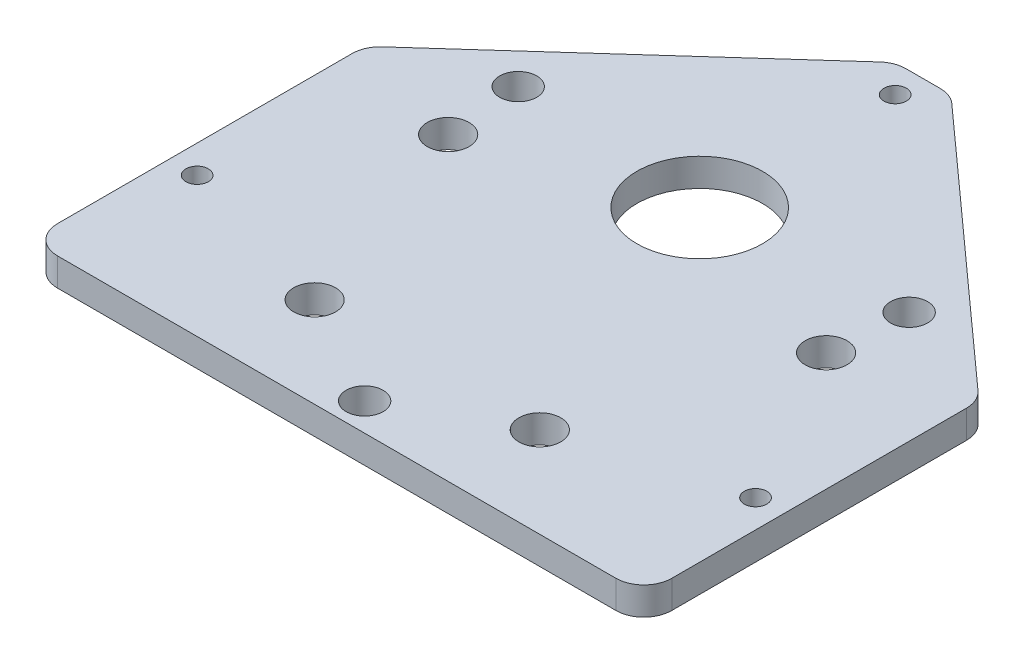
ISO-10303-21;
HEADER;
FILE_DESCRIPTION(('STEP AP214'),'2;1');
FILE_NAME('part.step','',(''),(''),'','','');
FILE_SCHEMA(('AUTOMOTIVE_DESIGN { 1 0 10303 214 1 1 1 1 }'));
ENDSEC;
DATA;
#1=APPLICATION_CONTEXT('core data for automotive mechanical design processes');
#2=APPLICATION_PROTOCOL_DEFINITION('international standard','automotive_design',2000,#1);
#3=PRODUCT_CONTEXT('',#1,'mechanical');
#4=PRODUCT('Part','Part','',(#3));
#5=PRODUCT_RELATED_PRODUCT_CATEGORY('part','',(#4));
#6=PRODUCT_DEFINITION_FORMATION('','',#4);
#7=PRODUCT_DEFINITION_CONTEXT('part definition',#1,'design');
#8=PRODUCT_DEFINITION('design','',#6,#7);
#9=PRODUCT_DEFINITION_SHAPE('','',#8);
#10=(LENGTH_UNIT() NAMED_UNIT(*) SI_UNIT(.MILLI.,.METRE.));
#11=(NAMED_UNIT(*) PLANE_ANGLE_UNIT() SI_UNIT($,.RADIAN.));
#12=(NAMED_UNIT(*) SI_UNIT($,.STERADIAN.) SOLID_ANGLE_UNIT());
#13=UNCERTAINTY_MEASURE_WITH_UNIT(LENGTH_MEASURE(1.E-05),#10,'distance_accuracy_value','');
#14=(GEOMETRIC_REPRESENTATION_CONTEXT(3) GLOBAL_UNCERTAINTY_ASSIGNED_CONTEXT((#13)) GLOBAL_UNIT_ASSIGNED_CONTEXT((#10,
#11,#12)) REPRESENTATION_CONTEXT('',''));
#15=CARTESIAN_POINT('',(0.,0.,0.));
#16=DIRECTION('',(0.,0.,1.));
#17=DIRECTION('',(1.,0.,0.));
#18=AXIS2_PLACEMENT_3D('',#15,#16,#17);
#19=CARTESIAN_POINT('',(-69.85,6.35,-57.15));
#20=DIRECTION('',(1.,0.,0.));
#21=DIRECTION('',(0.,0.,-1.));
#22=AXIS2_PLACEMENT_3D('',#19,#20,#21);
#23=PLANE('',#22);
#24=DIRECTION('',(0.,0.,1.));
#25=VECTOR('',#24,1.);
#26=CARTESIAN_POINT('',(-69.85,6.35,-57.15));
#27=LINE('',#26,#25);
#28=CARTESIAN_POINT('',(-69.85,6.35,-54.3219487301082));
#29=VERTEX_POINT('',#28);
#30=CARTESIAN_POINT('',(-69.85,6.35,12.7));
#31=VERTEX_POINT('',#30);
#32=EDGE_CURVE('E151',#29,#31,#27,.T.);
#33=ORIENTED_EDGE('',*,*,#32,.F.);
#34=DIRECTION('',(0.,-1.,0.));
#35=VECTOR('',#34,1.);
#36=CARTESIAN_POINT('',(-69.85,6.35,-54.3219487301082));
#37=LINE('',#36,#35);
#38=CARTESIAN_POINT('',(-69.85,0.,-54.3219487301082));
#39=VERTEX_POINT('',#38);
#40=EDGE_CURVE('E11',#29,#39,#37,.T.);
#41=ORIENTED_EDGE('',*,*,#40,.T.);
#42=DIRECTION('',(0.,0.,1.));
#43=VECTOR('',#42,1.);
#44=CARTESIAN_POINT('',(-69.85,0.,-57.15));
#45=LINE('',#44,#43);
#46=CARTESIAN_POINT('',(-69.85,0.,12.7));
#47=VERTEX_POINT('',#46);
#48=EDGE_CURVE('E221',#39,#47,#45,.T.);
#49=ORIENTED_EDGE('',*,*,#48,.T.);
#50=DIRECTION('',(0.,-1.,0.));
#51=VECTOR('',#50,1.);
#52=CARTESIAN_POINT('',(-69.85,6.35,12.7));
#53=LINE('',#52,#51);
#54=EDGE_CURVE('E41',#47,#31,#53,.F.);
#55=ORIENTED_EDGE('',*,*,#54,.T.);
#56=EDGE_LOOP('',(#33,#41,#49,#55));
#57=FACE_BOUND('',#56,.T.);
#58=ADVANCED_FACE('F33',(#57),#23,.F.);
#59=CARTESIAN_POINT('',(-69.85,6.35,19.05));
#60=DIRECTION('',(0.,0.,-1.));
#61=DIRECTION('',(-1.,0.,0.));
#62=AXIS2_PLACEMENT_3D('',#59,#60,#61);
#63=PLANE('',#62);
#64=DIRECTION('',(1.,0.,0.));
#65=VECTOR('',#64,1.);
#66=CARTESIAN_POINT('',(-69.85,0.,19.05));
#67=LINE('',#66,#65);
#68=CARTESIAN_POINT('',(-63.5,0.,19.05));
#69=VERTEX_POINT('',#68);
#70=CARTESIAN_POINT('',(63.5,0.,19.05));
#71=VERTEX_POINT('',#70);
#72=EDGE_CURVE('E234',#69,#71,#67,.T.);
#73=ORIENTED_EDGE('',*,*,#72,.T.);
#74=DIRECTION('',(0.,-1.,0.));
#75=VECTOR('',#74,1.);
#76=CARTESIAN_POINT('',(63.5,6.35,19.05));
#77=LINE('',#76,#75);
#78=CARTESIAN_POINT('',(63.5,6.35,19.05));
#79=VERTEX_POINT('',#78);
#80=EDGE_CURVE('E215',#71,#79,#77,.F.);
#81=ORIENTED_EDGE('',*,*,#80,.T.);
#82=DIRECTION('',(1.,0.,0.));
#83=VECTOR('',#82,1.);
#84=CARTESIAN_POINT('',(-69.85,6.35,19.05));
#85=LINE('',#84,#83);
#86=CARTESIAN_POINT('',(-63.5,6.35,19.05));
#87=VERTEX_POINT('',#86);
#88=EDGE_CURVE('E155',#87,#79,#85,.T.);
#89=ORIENTED_EDGE('',*,*,#88,.F.);
#90=DIRECTION('',(0.,-1.,0.));
#91=VECTOR('',#90,1.);
#92=CARTESIAN_POINT('',(-63.5,6.35,19.05));
#93=LINE('',#92,#91);
#94=EDGE_CURVE('E212',#87,#69,#93,.T.);
#95=ORIENTED_EDGE('',*,*,#94,.T.);
#96=EDGE_LOOP('',(#73,#81,#89,#95));
#97=FACE_BOUND('',#96,.T.);
#98=ADVANCED_FACE('F233',(#97),#63,.F.);
#99=CARTESIAN_POINT('',(69.85,6.35,19.05));
#100=DIRECTION('',(-1.,0.,0.));
#101=DIRECTION('',(0.,0.,1.));
#102=AXIS2_PLACEMENT_3D('',#99,#100,#101);
#103=PLANE('',#102);
#104=DIRECTION('',(0.,0.,-1.));
#105=VECTOR('',#104,1.);
#106=CARTESIAN_POINT('',(69.85,0.,19.05));
#107=LINE('',#106,#105);
#108=CARTESIAN_POINT('',(69.85,0.,12.7));
#109=VERTEX_POINT('',#108);
#110=CARTESIAN_POINT('',(69.85,0.,-54.3219487301082));
#111=VERTEX_POINT('',#110);
#112=EDGE_CURVE('E237',#109,#111,#107,.T.);
#113=ORIENTED_EDGE('',*,*,#112,.T.);
#114=DIRECTION('',(0.,-1.,0.));
#115=VECTOR('',#114,1.);
#116=CARTESIAN_POINT('',(69.85,6.35,-54.3219487301082));
#117=LINE('',#116,#115);
#118=CARTESIAN_POINT('',(69.85,6.35,-54.3219487301082));
#119=VERTEX_POINT('',#118);
#120=EDGE_CURVE('E210',#111,#119,#117,.F.);
#121=ORIENTED_EDGE('',*,*,#120,.T.);
#122=DIRECTION('',(0.,0.,-1.));
#123=VECTOR('',#122,1.);
#124=CARTESIAN_POINT('',(69.85,6.35,19.05));
#125=LINE('',#124,#123);
#126=CARTESIAN_POINT('',(69.85,6.35,12.7));
#127=VERTEX_POINT('',#126);
#128=EDGE_CURVE('E257',#127,#119,#125,.T.);
#129=ORIENTED_EDGE('',*,*,#128,.F.);
#130=DIRECTION('',(0.,-1.,0.));
#131=VECTOR('',#130,1.);
#132=CARTESIAN_POINT('',(69.85,6.35,12.7));
#133=LINE('',#132,#131);
#134=EDGE_CURVE('E207',#127,#109,#133,.T.);
#135=ORIENTED_EDGE('',*,*,#134,.T.);
#136=EDGE_LOOP('',(#113,#121,#129,#135));
#137=FACE_BOUND('',#136,.T.);
#138=ADVANCED_FACE('F353',(#137),#103,.F.);
#139=CARTESIAN_POINT('',(69.85,6.35,-57.15));
#140=DIRECTION('',(-0.66896473162245,0.,0.743294146247166));
#141=DIRECTION('',(0.743294146247166,0.,0.66896473162245));
#142=AXIS2_PLACEMENT_3D('',#139,#140,#141);
#143=PLANE('',#142);
#144=DIRECTION('',(-0.743294146247166,0.,-0.66896473162245));
#145=VECTOR('',#144,1.);
#146=CARTESIAN_POINT('',(69.85,0.,-57.15));
#147=LINE('',#146,#145);
#148=CARTESIAN_POINT('',(67.7479260458025,0.,-59.0418665587777));
#149=VERTEX_POINT('',#148);
#150=CARTESIAN_POINT('',(8.16120241258942,0.,-112.669917828669));
#151=VERTEX_POINT('',#150);
#152=EDGE_CURVE('E157',#149,#151,#147,.T.);
#153=ORIENTED_EDGE('',*,*,#152,.T.);
#154=DIRECTION('',(0.,-1.,0.));
#155=VECTOR('',#154,1.);
#156=CARTESIAN_POINT('',(8.16120241258941,6.35,-112.669917828669));
#157=LINE('',#156,#155);
#158=CARTESIAN_POINT('',(8.16120241258942,6.35,-112.669917828669));
#159=VERTEX_POINT('',#158);
#160=EDGE_CURVE('E48',#151,#159,#157,.F.);
#161=ORIENTED_EDGE('',*,*,#160,.T.);
#162=DIRECTION('',(-0.743294146247166,0.,-0.66896473162245));
#163=VECTOR('',#162,1.);
#164=CARTESIAN_POINT('',(69.85,6.35,-57.15));
#165=LINE('',#164,#163);
#166=CARTESIAN_POINT('',(67.7479260458025,6.35,-59.0418665587777));
#167=VERTEX_POINT('',#166);
#168=EDGE_CURVE('E253',#167,#159,#165,.T.);
#169=ORIENTED_EDGE('',*,*,#168,.F.);
#170=DIRECTION('',(0.,-1.,0.));
#171=VECTOR('',#170,1.);
#172=CARTESIAN_POINT('',(67.7479260458025,6.35,-59.0418665587777));
#173=LINE('',#172,#171);
#174=EDGE_CURVE('E203',#167,#149,#173,.T.);
#175=ORIENTED_EDGE('',*,*,#174,.T.);
#176=EDGE_LOOP('',(#153,#161,#169,#175));
#177=FACE_BOUND('',#176,.T.);
#178=ADVANCED_FACE('F245',(#177),#143,.F.);
#179=CARTESIAN_POINT('',(6.34999999999999,6.35,-114.3));
#180=DIRECTION('',(0.,0.,1.));
#181=DIRECTION('',(1.,0.,0.));
#182=AXIS2_PLACEMENT_3D('',#179,#180,#181);
#183=PLANE('',#182);
#184=DIRECTION('',(-1.,0.,0.));
#185=VECTOR('',#184,1.);
#186=CARTESIAN_POINT('',(6.34999999999999,0.,-114.3));
#187=LINE('',#186,#185);
#188=CARTESIAN_POINT('',(3.91327636678685,0.,-114.3));
#189=VERTEX_POINT('',#188);
#190=CARTESIAN_POINT('',(-3.91327636678688,0.,-114.3));
#191=VERTEX_POINT('',#190);
#192=EDGE_CURVE('E152',#189,#191,#187,.T.);
#193=ORIENTED_EDGE('',*,*,#192,.T.);
#194=DIRECTION('',(0.,-1.,0.));
#195=VECTOR('',#194,1.);
#196=CARTESIAN_POINT('',(-3.91327636678688,6.35,-114.3));
#197=LINE('',#196,#195);
#198=CARTESIAN_POINT('',(-3.91327636678688,6.35,-114.3));
#199=VERTEX_POINT('',#198);
#200=EDGE_CURVE('E129',#191,#199,#197,.F.);
#201=ORIENTED_EDGE('',*,*,#200,.T.);
#202=DIRECTION('',(-1.,0.,0.));
#203=VECTOR('',#202,1.);
#204=CARTESIAN_POINT('',(6.34999999999999,6.35,-114.3));
#205=LINE('',#204,#203);
#206=CARTESIAN_POINT('',(3.91327636678685,6.35,-114.3));
#207=VERTEX_POINT('',#206);
#208=EDGE_CURVE('E252',#207,#199,#205,.T.);
#209=ORIENTED_EDGE('',*,*,#208,.F.);
#210=DIRECTION('',(0.,-1.,0.));
#211=VECTOR('',#210,1.);
#212=CARTESIAN_POINT('',(3.91327636678685,6.35,-114.3));
#213=LINE('',#212,#211);
#214=EDGE_CURVE('E134',#207,#189,#213,.T.);
#215=ORIENTED_EDGE('',*,*,#214,.T.);
#216=EDGE_LOOP('',(#193,#201,#209,#215));
#217=FACE_BOUND('',#216,.T.);
#218=ADVANCED_FACE('F255',(#217),#183,.F.);
#219=CARTESIAN_POINT('',(-6.35000000000001,6.35,-114.3));
#220=DIRECTION('',(0.66896473162245,0.,0.743294146247166));
#221=DIRECTION('',(0.743294146247166,0.,-0.66896473162245));
#222=AXIS2_PLACEMENT_3D('',#219,#220,#221);
#223=PLANE('',#222);
#224=DIRECTION('',(-0.743294146247166,0.,0.66896473162245));
#225=VECTOR('',#224,1.);
#226=CARTESIAN_POINT('',(-6.35000000000001,6.35,-114.3));
#227=LINE('',#226,#225);
#228=CARTESIAN_POINT('',(-8.16120241258944,6.35,-112.66991782867));
#229=VERTEX_POINT('',#228);
#230=CARTESIAN_POINT('',(-67.7479260458025,6.35,-59.0418665587777));
#231=VERTEX_POINT('',#230);
#232=EDGE_CURVE('E144',#229,#231,#227,.T.);
#233=ORIENTED_EDGE('',*,*,#232,.F.);
#234=DIRECTION('',(0.,-1.,0.));
#235=VECTOR('',#234,1.);
#236=CARTESIAN_POINT('',(-8.16120241258944,6.35,-112.66991782867));
#237=LINE('',#236,#235);
#238=CARTESIAN_POINT('',(-8.16120241258944,0.,-112.66991782867));
#239=VERTEX_POINT('',#238);
#240=EDGE_CURVE('E128',#229,#239,#237,.T.);
#241=ORIENTED_EDGE('',*,*,#240,.T.);
#242=DIRECTION('',(-0.743294146247166,0.,0.66896473162245));
#243=VECTOR('',#242,1.);
#244=CARTESIAN_POINT('',(-6.35000000000001,0.,-114.3));
#245=LINE('',#244,#243);
#246=CARTESIAN_POINT('',(-67.7479260458025,0.,-59.0418665587777));
#247=VERTEX_POINT('',#246);
#248=EDGE_CURVE('E141',#239,#247,#245,.T.);
#249=ORIENTED_EDGE('',*,*,#248,.T.);
#250=DIRECTION('',(0.,-1.,0.));
#251=VECTOR('',#250,1.);
#252=CARTESIAN_POINT('',(-67.7479260458026,6.35,-59.0418665587777));
#253=LINE('',#252,#251);
#254=EDGE_CURVE('E146',#247,#231,#253,.F.);
#255=ORIENTED_EDGE('',*,*,#254,.T.);
#256=EDGE_LOOP('',(#233,#241,#249,#255));
#257=FACE_BOUND('',#256,.T.);
#258=ADVANCED_FACE('F140',(#257),#223,.F.);
#259=CARTESIAN_POINT('',(0.,6.35,0.));
#260=DIRECTION('',(0.,1.,0.));
#261=DIRECTION('',(0.,0.,1.));
#262=AXIS2_PLACEMENT_3D('',#259,#260,#261);
#263=PLANE('',#262);
#264=CARTESIAN_POINT('',(44.4499999999999,6.35,-66.675));
#265=DIRECTION('',(0.,-1.,0.));
#266=DIRECTION('',(0.,0.,-1.));
#267=AXIS2_PLACEMENT_3D('',#264,#265,#266);
#268=CIRCLE('',#267,4.2164);
#269=CARTESIAN_POINT('',(44.4499999999999,6.35,-70.8914));
#270=VERTEX_POINT('',#269);
#271=EDGE_CURVE('E301',#270,#270,#268,.T.);
#272=ORIENTED_EDGE('',*,*,#271,.T.);
#273=EDGE_LOOP('',(#272));
#274=FACE_BOUND('',#273,.T.);
#275=CARTESIAN_POINT('',(-44.4500000000001,6.35,-66.675));
#276=DIRECTION('',(0.,-1.,0.));
#277=DIRECTION('',(0.,0.,-1.));
#278=AXIS2_PLACEMENT_3D('',#275,#276,#277);
#279=CIRCLE('',#278,4.2164);
#280=CARTESIAN_POINT('',(-44.4500000000001,6.35,-70.8914));
#281=VERTEX_POINT('',#280);
#282=EDGE_CURVE('E295',#281,#281,#279,.T.);
#283=ORIENTED_EDGE('',*,*,#282,.T.);
#284=EDGE_LOOP('',(#283));
#285=FACE_BOUND('',#284,.T.);
#286=CARTESIAN_POINT('',(0.,6.35,12.7));
#287=DIRECTION('',(0.,-1.,0.));
#288=DIRECTION('',(0.,0.,-1.));
#289=AXIS2_PLACEMENT_3D('',#286,#287,#288);
#290=CIRCLE('',#289,4.2164);
#291=CARTESIAN_POINT('',(0.,6.35,8.48359999999998));
#292=VERTEX_POINT('',#291);
#293=EDGE_CURVE('E289',#292,#292,#290,.T.);
#294=ORIENTED_EDGE('',*,*,#293,.T.);
#295=EDGE_LOOP('',(#294));
#296=FACE_BOUND('',#295,.T.);
#297=CARTESIAN_POINT('',(-63.5,6.35,-12.7));
#298=DIRECTION('',(0.,1.,0.));
#299=DIRECTION('',(0.,0.,1.));
#300=AXIS2_PLACEMENT_3D('',#297,#298,#299);
#301=CIRCLE('',#300,2.55269999999999);
#302=CARTESIAN_POINT('',(-63.5,6.35,-10.1473));
#303=VERTEX_POINT('',#302);
#304=EDGE_CURVE('E286',#303,#303,#301,.T.);
#305=ORIENTED_EDGE('',*,*,#304,.F.);
#306=EDGE_LOOP('',(#305));
#307=FACE_BOUND('',#306,.T.);
#308=CARTESIAN_POINT('',(63.5000000000001,6.35,-12.7));
#309=DIRECTION('',(0.,1.,0.));
#310=DIRECTION('',(0.,0.,1.));
#311=AXIS2_PLACEMENT_3D('',#308,#309,#310);
#312=CIRCLE('',#311,2.55269999999999);
#313=CARTESIAN_POINT('',(63.5000000000001,6.35,-10.1473));
#314=VERTEX_POINT('',#313);
#315=EDGE_CURVE('E180',#314,#314,#312,.T.);
#316=ORIENTED_EDGE('',*,*,#315,.F.);
#317=EDGE_LOOP('',(#316));
#318=FACE_BOUND('',#317,.T.);
#319=CARTESIAN_POINT('',(0.,6.35,-107.95));
#320=DIRECTION('',(0.,1.,0.));
#321=DIRECTION('',(0.,0.,1.));
#322=AXIS2_PLACEMENT_3D('',#319,#320,#321);
#323=CIRCLE('',#322,2.55269999999999);
#324=CARTESIAN_POINT('',(0.,6.35,-105.3973));
#325=VERTEX_POINT('',#324);
#326=EDGE_CURVE('E179',#325,#325,#323,.T.);
#327=ORIENTED_EDGE('',*,*,#326,.F.);
#328=EDGE_LOOP('',(#327));
#329=FACE_BOUND('',#328,.T.);
#330=CARTESIAN_POINT('',(-25.6026883595281,6.35,-1.53180743203795));
#331=DIRECTION('',(0.,1.,0.));
#332=DIRECTION('',(0.,0.,1.));
#333=AXIS2_PLACEMENT_3D('',#330,#331,#332);
#334=CIRCLE('',#333,4.76250000000001);
#335=CARTESIAN_POINT('',(-25.6026883595281,6.35,3.23069256796206));
#336=VERTEX_POINT('',#335);
#337=EDGE_CURVE('E170',#336,#336,#334,.T.);
#338=ORIENTED_EDGE('',*,*,#337,.F.);
#339=EDGE_LOOP('',(#338));
#340=FACE_BOUND('',#339,.T.);
#341=CARTESIAN_POINT('',(25.6026883595282,6.35,-1.53180743203789));
#342=DIRECTION('',(0.,1.,0.));
#343=DIRECTION('',(0.,0.,1.));
#344=AXIS2_PLACEMENT_3D('',#341,#342,#343);
#345=CIRCLE('',#344,4.76250000000001);
#346=CARTESIAN_POINT('',(25.6026883595282,6.35,3.23069256796212));
#347=VERTEX_POINT('',#346);
#348=EDGE_CURVE('E271',#347,#347,#345,.T.);
#349=ORIENTED_EDGE('',*,*,#348,.F.);
#350=EDGE_LOOP('',(#349));
#351=FACE_BOUND('',#350,.T.);
#352=CARTESIAN_POINT('',(42.9773116404719,6.35,-49.2681925679621));
#353=DIRECTION('',(0.,1.,0.));
#354=DIRECTION('',(0.,0.,1.));
#355=AXIS2_PLACEMENT_3D('',#352,#353,#354);
#356=CIRCLE('',#355,4.76250000000001);
#357=CARTESIAN_POINT('',(42.9773116404719,6.35,-44.5056925679621));
#358=VERTEX_POINT('',#357);
#359=EDGE_CURVE('E268',#358,#358,#356,.T.);
#360=ORIENTED_EDGE('',*,*,#359,.F.);
#361=EDGE_LOOP('',(#360));
#362=FACE_BOUND('',#361,.T.);
#363=CARTESIAN_POINT('',(-42.9773116404717,6.35,-49.2681925679622));
#364=DIRECTION('',(0.,1.,0.));
#365=DIRECTION('',(0.,0.,1.));
#366=AXIS2_PLACEMENT_3D('',#363,#364,#365);
#367=CIRCLE('',#366,4.76250000000001);
#368=CARTESIAN_POINT('',(-42.9773116404717,6.35,-44.5056925679622));
#369=VERTEX_POINT('',#368);
#370=EDGE_CURVE('E165',#369,#369,#367,.T.);
#371=ORIENTED_EDGE('',*,*,#370,.F.);
#372=EDGE_LOOP('',(#371));
#373=FACE_BOUND('',#372,.T.);
#374=CARTESIAN_POINT('',(0.,6.35,-63.5));
#375=DIRECTION('',(0.,1.,0.));
#376=DIRECTION('',(0.,0.,1.));
#377=AXIS2_PLACEMENT_3D('',#374,#375,#376);
#378=CIRCLE('',#377,14.2875);
#379=CARTESIAN_POINT('',(0.,6.35,-49.2125));
#380=VERTEX_POINT('',#379);
#381=EDGE_CURVE('E164',#380,#380,#378,.T.);
#382=ORIENTED_EDGE('',*,*,#381,.F.);
#383=EDGE_LOOP('',(#382));
#384=FACE_BOUND('',#383,.T.);
#385=ORIENTED_EDGE('',*,*,#208,.T.);
#386=CARTESIAN_POINT('',(-3.91327636678688,6.35,-107.95));
#387=DIRECTION('',(0.,1.,0.));
#388=DIRECTION('',(0.,0.,1.));
#389=AXIS2_PLACEMENT_3D('',#386,#387,#388);
#390=CIRCLE('',#389,6.35);
#391=EDGE_CURVE('E201',#199,#229,#390,.T.);
#392=ORIENTED_EDGE('',*,*,#391,.T.);
#393=ORIENTED_EDGE('',*,*,#232,.T.);
#394=CARTESIAN_POINT('',(-63.5,6.35,-54.3219487301082));
#395=DIRECTION('',(0.,1.,0.));
#396=DIRECTION('',(0.,0.,1.));
#397=AXIS2_PLACEMENT_3D('',#394,#395,#396);
#398=CIRCLE('',#397,6.35);
#399=EDGE_CURVE('E194',#231,#29,#398,.T.);
#400=ORIENTED_EDGE('',*,*,#399,.T.);
#401=ORIENTED_EDGE('',*,*,#32,.T.);
#402=CARTESIAN_POINT('',(-63.5,6.35,12.7));
#403=DIRECTION('',(0.,1.,0.));
#404=DIRECTION('',(0.,0.,1.));
#405=AXIS2_PLACEMENT_3D('',#402,#403,#404);
#406=CIRCLE('',#405,6.35);
#407=EDGE_CURVE('E192',#31,#87,#406,.T.);
#408=ORIENTED_EDGE('',*,*,#407,.T.);
#409=ORIENTED_EDGE('',*,*,#88,.T.);
#410=CARTESIAN_POINT('',(63.5,6.35,12.7));
#411=DIRECTION('',(0.,1.,0.));
#412=DIRECTION('',(0.,0.,1.));
#413=AXIS2_PLACEMENT_3D('',#410,#411,#412);
#414=CIRCLE('',#413,6.35);
#415=EDGE_CURVE('E196',#79,#127,#414,.T.);
#416=ORIENTED_EDGE('',*,*,#415,.T.);
#417=ORIENTED_EDGE('',*,*,#128,.T.);
#418=CARTESIAN_POINT('',(63.5,6.35,-54.3219487301082));
#419=DIRECTION('',(0.,1.,0.));
#420=DIRECTION('',(0.,0.,1.));
#421=AXIS2_PLACEMENT_3D('',#418,#419,#420);
#422=CIRCLE('',#421,6.35);
#423=EDGE_CURVE('E55',#119,#167,#422,.T.);
#424=ORIENTED_EDGE('',*,*,#423,.T.);
#425=ORIENTED_EDGE('',*,*,#168,.T.);
#426=CARTESIAN_POINT('',(3.91327636678685,6.35,-107.95));
#427=DIRECTION('',(0.,1.,0.));
#428=DIRECTION('',(0.,0.,1.));
#429=AXIS2_PLACEMENT_3D('',#426,#427,#428);
#430=CIRCLE('',#429,6.35);
#431=EDGE_CURVE('E199',#159,#207,#430,.T.);
#432=ORIENTED_EDGE('',*,*,#431,.T.);
#433=EDGE_LOOP('',(#385,#392,#393,#400,#401,#408,#409,#416,#417,#424,#425,#432));
#434=FACE_BOUND('',#433,.T.);
#435=ADVANCED_FACE('F225',(#274,#285,#296,#307,#318,#329,#340,#351,#362,#373,#384,#434),#263,.T.);
#436=CARTESIAN_POINT('',(0.,0.,0.));
#437=DIRECTION('',(0.,1.,0.));
#438=DIRECTION('',(0.,0.,1.));
#439=AXIS2_PLACEMENT_3D('',#436,#437,#438);
#440=PLANE('',#439);
#441=CARTESIAN_POINT('',(44.4499999999999,0.,-66.675));
#442=DIRECTION('',(0.,-1.,0.));
#443=DIRECTION('',(0.,0.,-1.));
#444=AXIS2_PLACEMENT_3D('',#441,#442,#443);
#445=CIRCLE('',#444,4.21639999999998);
#446=CARTESIAN_POINT('',(44.4499999999999,0.,-70.8914));
#447=VERTEX_POINT('',#446);
#448=EDGE_CURVE('E304',#447,#447,#445,.T.);
#449=ORIENTED_EDGE('',*,*,#448,.F.);
#450=EDGE_LOOP('',(#449));
#451=FACE_BOUND('',#450,.T.);
#452=CARTESIAN_POINT('',(-44.4500000000001,0.,-66.675));
#453=DIRECTION('',(0.,-1.,0.));
#454=DIRECTION('',(0.,0.,-1.));
#455=AXIS2_PLACEMENT_3D('',#452,#453,#454);
#456=CIRCLE('',#455,4.21639999999998);
#457=CARTESIAN_POINT('',(-44.4500000000001,0.,-70.8914));
#458=VERTEX_POINT('',#457);
#459=EDGE_CURVE('E298',#458,#458,#456,.T.);
#460=ORIENTED_EDGE('',*,*,#459,.F.);
#461=EDGE_LOOP('',(#460));
#462=FACE_BOUND('',#461,.T.);
#463=CARTESIAN_POINT('',(0.,0.,12.7));
#464=DIRECTION('',(0.,-1.,0.));
#465=DIRECTION('',(0.,0.,-1.));
#466=AXIS2_PLACEMENT_3D('',#463,#464,#465);
#467=CIRCLE('',#466,4.21639999999998);
#468=CARTESIAN_POINT('',(0.,0.,8.4836));
#469=VERTEX_POINT('',#468);
#470=EDGE_CURVE('E292',#469,#469,#467,.T.);
#471=ORIENTED_EDGE('',*,*,#470,.F.);
#472=EDGE_LOOP('',(#471));
#473=FACE_BOUND('',#472,.T.);
#474=CARTESIAN_POINT('',(-63.5,0.,-12.7));
#475=DIRECTION('',(0.,1.,0.));
#476=DIRECTION('',(0.,0.,1.));
#477=AXIS2_PLACEMENT_3D('',#474,#475,#476);
#478=CIRCLE('',#477,2.55269999999998);
#479=CARTESIAN_POINT('',(-63.5,0.,-10.1473));
#480=VERTEX_POINT('',#479);
#481=EDGE_CURVE('E283',#480,#480,#478,.T.);
#482=ORIENTED_EDGE('',*,*,#481,.T.);
#483=EDGE_LOOP('',(#482));
#484=FACE_BOUND('',#483,.T.);
#485=CARTESIAN_POINT('',(63.5000000000001,0.,-12.7));
#486=DIRECTION('',(0.,1.,0.));
#487=DIRECTION('',(0.,0.,1.));
#488=AXIS2_PLACEMENT_3D('',#485,#486,#487);
#489=CIRCLE('',#488,2.55269999999998);
#490=CARTESIAN_POINT('',(63.5000000000001,0.,-10.1473));
#491=VERTEX_POINT('',#490);
#492=EDGE_CURVE('E176',#491,#491,#489,.T.);
#493=ORIENTED_EDGE('',*,*,#492,.T.);
#494=EDGE_LOOP('',(#493));
#495=FACE_BOUND('',#494,.T.);
#496=CARTESIAN_POINT('',(0.,0.,-107.95));
#497=DIRECTION('',(0.,1.,0.));
#498=DIRECTION('',(0.,0.,1.));
#499=AXIS2_PLACEMENT_3D('',#496,#497,#498);
#500=CIRCLE('',#499,2.55269999999998);
#501=CARTESIAN_POINT('',(0.,0.,-105.3973));
#502=VERTEX_POINT('',#501);
#503=EDGE_CURVE('E272',#502,#502,#500,.T.);
#504=ORIENTED_EDGE('',*,*,#503,.T.);
#505=EDGE_LOOP('',(#504));
#506=FACE_BOUND('',#505,.T.);
#507=CARTESIAN_POINT('',(-25.6026883595281,0.,-1.53180743203795));
#508=DIRECTION('',(0.,1.,0.));
#509=DIRECTION('',(0.,0.,1.));
#510=AXIS2_PLACEMENT_3D('',#507,#508,#509);
#511=CIRCLE('',#510,4.76250000000001);
#512=CARTESIAN_POINT('',(-25.6026883595281,0.,3.23069256796206));
#513=VERTEX_POINT('',#512);
#514=EDGE_CURVE('E173',#513,#513,#511,.T.);
#515=ORIENTED_EDGE('',*,*,#514,.T.);
#516=EDGE_LOOP('',(#515));
#517=FACE_BOUND('',#516,.T.);
#518=CARTESIAN_POINT('',(25.6026883595282,0.,-1.53180743203789));
#519=DIRECTION('',(0.,1.,0.));
#520=DIRECTION('',(0.,0.,1.));
#521=AXIS2_PLACEMENT_3D('',#518,#519,#520);
#522=CIRCLE('',#521,4.76250000000001);
#523=CARTESIAN_POINT('',(25.6026883595282,0.,3.23069256796212));
#524=VERTEX_POINT('',#523);
#525=EDGE_CURVE('E169',#524,#524,#522,.T.);
#526=ORIENTED_EDGE('',*,*,#525,.T.);
#527=EDGE_LOOP('',(#526));
#528=FACE_BOUND('',#527,.T.);
#529=CARTESIAN_POINT('',(42.9773116404719,0.,-49.2681925679621));
#530=DIRECTION('',(0.,1.,0.));
#531=DIRECTION('',(0.,0.,1.));
#532=AXIS2_PLACEMENT_3D('',#529,#530,#531);
#533=CIRCLE('',#532,4.76250000000001);
#534=CARTESIAN_POINT('',(42.9773116404719,0.,-44.5056925679621));
#535=VERTEX_POINT('',#534);
#536=EDGE_CURVE('E166',#535,#535,#533,.T.);
#537=ORIENTED_EDGE('',*,*,#536,.T.);
#538=EDGE_LOOP('',(#537));
#539=FACE_BOUND('',#538,.T.);
#540=CARTESIAN_POINT('',(-42.9773116404717,0.,-49.2681925679622));
#541=DIRECTION('',(0.,1.,0.));
#542=DIRECTION('',(0.,0.,1.));
#543=AXIS2_PLACEMENT_3D('',#540,#541,#542);
#544=CIRCLE('',#543,4.76250000000001);
#545=CARTESIAN_POINT('',(-42.9773116404717,0.,-44.5056925679622));
#546=VERTEX_POINT('',#545);
#547=EDGE_CURVE('E161',#546,#546,#544,.T.);
#548=ORIENTED_EDGE('',*,*,#547,.T.);
#549=EDGE_LOOP('',(#548));
#550=FACE_BOUND('',#549,.T.);
#551=CARTESIAN_POINT('',(0.,0.,-63.5));
#552=DIRECTION('',(0.,1.,0.));
#553=DIRECTION('',(0.,0.,1.));
#554=AXIS2_PLACEMENT_3D('',#551,#552,#553);
#555=CIRCLE('',#554,14.2875);
#556=CARTESIAN_POINT('',(0.,0.,-49.2125));
#557=VERTEX_POINT('',#556);
#558=EDGE_CURVE('E241',#557,#557,#555,.T.);
#559=ORIENTED_EDGE('',*,*,#558,.T.);
#560=EDGE_LOOP('',(#559));
#561=FACE_BOUND('',#560,.T.);
#562=ORIENTED_EDGE('',*,*,#248,.F.);
#563=CARTESIAN_POINT('',(-3.91327636678688,0.,-107.95));
#564=DIRECTION('',(0.,1.,0.));
#565=DIRECTION('',(0.,0.,1.));
#566=AXIS2_PLACEMENT_3D('',#563,#564,#565);
#567=CIRCLE('',#566,6.35);
#568=EDGE_CURVE('E124',#239,#191,#567,.F.);
#569=ORIENTED_EDGE('',*,*,#568,.T.);
#570=ORIENTED_EDGE('',*,*,#192,.F.);
#571=CARTESIAN_POINT('',(3.91327636678685,0.,-107.95));
#572=DIRECTION('',(0.,1.,0.));
#573=DIRECTION('',(0.,0.,1.));
#574=AXIS2_PLACEMENT_3D('',#571,#572,#573);
#575=CIRCLE('',#574,6.35);
#576=EDGE_CURVE('E135',#189,#151,#575,.F.);
#577=ORIENTED_EDGE('',*,*,#576,.T.);
#578=ORIENTED_EDGE('',*,*,#152,.F.);
#579=CARTESIAN_POINT('',(63.5,0.,-54.3219487301082));
#580=DIRECTION('',(0.,1.,0.));
#581=DIRECTION('',(0.,0.,1.));
#582=AXIS2_PLACEMENT_3D('',#579,#580,#581);
#583=CIRCLE('',#582,6.35);
#584=EDGE_CURVE('E186',#149,#111,#583,.F.);
#585=ORIENTED_EDGE('',*,*,#584,.T.);
#586=ORIENTED_EDGE('',*,*,#112,.F.);
#587=CARTESIAN_POINT('',(63.5,0.,12.7));
#588=DIRECTION('',(0.,1.,0.));
#589=DIRECTION('',(0.,0.,1.));
#590=AXIS2_PLACEMENT_3D('',#587,#588,#589);
#591=CIRCLE('',#590,6.35);
#592=EDGE_CURVE('E184',#109,#71,#591,.F.);
#593=ORIENTED_EDGE('',*,*,#592,.T.);
#594=ORIENTED_EDGE('',*,*,#72,.F.);
#595=CARTESIAN_POINT('',(-63.5,0.,12.7));
#596=DIRECTION('',(0.,1.,0.));
#597=DIRECTION('',(0.,0.,1.));
#598=AXIS2_PLACEMENT_3D('',#595,#596,#597);
#599=CIRCLE('',#598,6.35);
#600=EDGE_CURVE('E145',#69,#47,#599,.F.);
#601=ORIENTED_EDGE('',*,*,#600,.T.);
#602=ORIENTED_EDGE('',*,*,#48,.F.);
#603=CARTESIAN_POINT('',(-63.5,0.,-54.3219487301082));
#604=DIRECTION('',(0.,1.,0.));
#605=DIRECTION('',(0.,0.,1.));
#606=AXIS2_PLACEMENT_3D('',#603,#604,#605);
#607=CIRCLE('',#606,6.35);
#608=EDGE_CURVE('E150',#39,#247,#607,.F.);
#609=ORIENTED_EDGE('',*,*,#608,.T.);
#610=EDGE_LOOP('',(#562,#569,#570,#577,#578,#585,#586,#593,#594,#601,#602,#609));
#611=FACE_BOUND('',#610,.T.);
#612=ADVANCED_FACE('F148',(#451,#462,#473,#484,#495,#506,#517,#528,#539,#550,#561,#611),#440,.F.);
#613=CARTESIAN_POINT('',(0.,0.,-63.5));
#614=DIRECTION('',(0.,1.,0.));
#615=DIRECTION('',(0.,0.,1.));
#616=AXIS2_PLACEMENT_3D('',#613,#614,#615);
#617=CYLINDRICAL_SURFACE('',#616,14.2875);
#618=ORIENTED_EDGE('',*,*,#558,.F.);
#619=EDGE_LOOP('',(#618));
#620=FACE_BOUND('',#619,.T.);
#621=ORIENTED_EDGE('',*,*,#381,.T.);
#622=EDGE_LOOP('',(#621));
#623=FACE_BOUND('',#622,.T.);
#624=ADVANCED_FACE('F312',(#620,#623),#617,.F.);
#625=CARTESIAN_POINT('',(-42.9773116404717,-44.45,-49.2681925679622));
#626=DIRECTION('',(0.,1.,0.));
#627=DIRECTION('',(0.,0.,1.));
#628=AXIS2_PLACEMENT_3D('',#625,#626,#627);
#629=CYLINDRICAL_SURFACE('',#628,4.76250000000001);
#630=ORIENTED_EDGE('',*,*,#370,.T.);
#631=EDGE_LOOP('',(#630));
#632=FACE_BOUND('',#631,.T.);
#633=ORIENTED_EDGE('',*,*,#547,.F.);
#634=EDGE_LOOP('',(#633));
#635=FACE_BOUND('',#634,.T.);
#636=ADVANCED_FACE('F336',(#632,#635),#629,.F.);
#637=CARTESIAN_POINT('',(42.9773116404719,-44.45,-49.2681925679621));
#638=DIRECTION('',(0.,1.,0.));
#639=DIRECTION('',(0.,0.,1.));
#640=AXIS2_PLACEMENT_3D('',#637,#638,#639);
#641=CYLINDRICAL_SURFACE('',#640,4.76250000000001);
#642=ORIENTED_EDGE('',*,*,#359,.T.);
#643=EDGE_LOOP('',(#642));
#644=FACE_BOUND('',#643,.T.);
#645=ORIENTED_EDGE('',*,*,#536,.F.);
#646=EDGE_LOOP('',(#645));
#647=FACE_BOUND('',#646,.T.);
#648=ADVANCED_FACE('F409',(#644,#647),#641,.F.);
#649=CARTESIAN_POINT('',(25.6026883595282,-44.45,-1.53180743203789));
#650=DIRECTION('',(0.,1.,0.));
#651=DIRECTION('',(0.,0.,1.));
#652=AXIS2_PLACEMENT_3D('',#649,#650,#651);
#653=CYLINDRICAL_SURFACE('',#652,4.76250000000001);
#654=ORIENTED_EDGE('',*,*,#348,.T.);
#655=EDGE_LOOP('',(#654));
#656=FACE_BOUND('',#655,.T.);
#657=ORIENTED_EDGE('',*,*,#525,.F.);
#658=EDGE_LOOP('',(#657));
#659=FACE_BOUND('',#658,.T.);
#660=ADVANCED_FACE('F405',(#656,#659),#653,.F.);
#661=CARTESIAN_POINT('',(-25.6026883595281,-44.45,-1.53180743203795));
#662=DIRECTION('',(0.,1.,0.));
#663=DIRECTION('',(0.,0.,1.));
#664=AXIS2_PLACEMENT_3D('',#661,#662,#663);
#665=CYLINDRICAL_SURFACE('',#664,4.76250000000001);
#666=ORIENTED_EDGE('',*,*,#337,.T.);
#667=EDGE_LOOP('',(#666));
#668=FACE_BOUND('',#667,.T.);
#669=ORIENTED_EDGE('',*,*,#514,.F.);
#670=EDGE_LOOP('',(#669));
#671=FACE_BOUND('',#670,.T.);
#672=ADVANCED_FACE('F401',(#668,#671),#665,.F.);
#673=CARTESIAN_POINT('',(0.,6.35,-107.95));
#674=DIRECTION('',(0.,1.,0.));
#675=DIRECTION('',(0.,0.,1.));
#676=AXIS2_PLACEMENT_3D('',#673,#674,#675);
#677=CYLINDRICAL_SURFACE('',#676,2.55269999999998);
#678=ORIENTED_EDGE('',*,*,#326,.T.);
#679=EDGE_LOOP('',(#678));
#680=FACE_BOUND('',#679,.T.);
#681=ORIENTED_EDGE('',*,*,#503,.F.);
#682=EDGE_LOOP('',(#681));
#683=FACE_BOUND('',#682,.T.);
#684=ADVANCED_FACE('F397',(#680,#683),#677,.F.);
#685=CARTESIAN_POINT('',(63.5000000000001,6.35,-12.7));
#686=DIRECTION('',(0.,1.,0.));
#687=DIRECTION('',(0.,0.,1.));
#688=AXIS2_PLACEMENT_3D('',#685,#686,#687);
#689=CYLINDRICAL_SURFACE('',#688,2.55269999999998);
#690=ORIENTED_EDGE('',*,*,#315,.T.);
#691=EDGE_LOOP('',(#690));
#692=FACE_BOUND('',#691,.T.);
#693=ORIENTED_EDGE('',*,*,#492,.F.);
#694=EDGE_LOOP('',(#693));
#695=FACE_BOUND('',#694,.T.);
#696=ADVANCED_FACE('F393',(#692,#695),#689,.F.);
#697=CARTESIAN_POINT('',(-63.5,6.35,-12.7));
#698=DIRECTION('',(0.,1.,0.));
#699=DIRECTION('',(0.,0.,1.));
#700=AXIS2_PLACEMENT_3D('',#697,#698,#699);
#701=CYLINDRICAL_SURFACE('',#700,2.55269999999998);
#702=ORIENTED_EDGE('',*,*,#304,.T.);
#703=EDGE_LOOP('',(#702));
#704=FACE_BOUND('',#703,.T.);
#705=ORIENTED_EDGE('',*,*,#481,.F.);
#706=EDGE_LOOP('',(#705));
#707=FACE_BOUND('',#706,.T.);
#708=ADVANCED_FACE('F359',(#704,#707),#701,.F.);
#709=CARTESIAN_POINT('',(-3.91327636678688,6.35,-107.95));
#710=DIRECTION('',(0.,-1.,0.));
#711=DIRECTION('',(0.,0.,-1.));
#712=AXIS2_PLACEMENT_3D('',#709,#710,#711);
#713=CYLINDRICAL_SURFACE('',#712,6.35);
#714=ORIENTED_EDGE('',*,*,#391,.F.);
#715=ORIENTED_EDGE('',*,*,#200,.F.);
#716=ORIENTED_EDGE('',*,*,#568,.F.);
#717=ORIENTED_EDGE('',*,*,#240,.F.);
#718=EDGE_LOOP('',(#714,#715,#716,#717));
#719=FACE_BOUND('',#718,.T.);
#720=ADVANCED_FACE('F127',(#719),#713,.T.);
#721=CARTESIAN_POINT('',(3.91327636678685,6.35,-107.95));
#722=DIRECTION('',(0.,-1.,0.));
#723=DIRECTION('',(0.,0.,-1.));
#724=AXIS2_PLACEMENT_3D('',#721,#722,#723);
#725=CYLINDRICAL_SURFACE('',#724,6.35);
#726=ORIENTED_EDGE('',*,*,#431,.F.);
#727=ORIENTED_EDGE('',*,*,#160,.F.);
#728=ORIENTED_EDGE('',*,*,#576,.F.);
#729=ORIENTED_EDGE('',*,*,#214,.F.);
#730=EDGE_LOOP('',(#726,#727,#728,#729));
#731=FACE_BOUND('',#730,.T.);
#732=ADVANCED_FACE('F249',(#731),#725,.T.);
#733=CARTESIAN_POINT('',(63.5,6.35,-54.3219487301082));
#734=DIRECTION('',(0.,-1.,0.));
#735=DIRECTION('',(0.,0.,-1.));
#736=AXIS2_PLACEMENT_3D('',#733,#734,#735);
#737=CYLINDRICAL_SURFACE('',#736,6.35);
#738=ORIENTED_EDGE('',*,*,#423,.F.);
#739=ORIENTED_EDGE('',*,*,#120,.F.);
#740=ORIENTED_EDGE('',*,*,#584,.F.);
#741=ORIENTED_EDGE('',*,*,#174,.F.);
#742=EDGE_LOOP('',(#738,#739,#740,#741));
#743=FACE_BOUND('',#742,.T.);
#744=ADVANCED_FACE('F362',(#743),#737,.T.);
#745=CARTESIAN_POINT('',(63.5,6.35,12.7));
#746=DIRECTION('',(0.,-1.,0.));
#747=DIRECTION('',(0.,0.,-1.));
#748=AXIS2_PLACEMENT_3D('',#745,#746,#747);
#749=CYLINDRICAL_SURFACE('',#748,6.35);
#750=ORIENTED_EDGE('',*,*,#415,.F.);
#751=ORIENTED_EDGE('',*,*,#80,.F.);
#752=ORIENTED_EDGE('',*,*,#592,.F.);
#753=ORIENTED_EDGE('',*,*,#134,.F.);
#754=EDGE_LOOP('',(#750,#751,#752,#753));
#755=FACE_BOUND('',#754,.T.);
#756=ADVANCED_FACE('F365',(#755),#749,.T.);
#757=CARTESIAN_POINT('',(-63.5,6.35,-54.3219487301082));
#758=DIRECTION('',(0.,-1.,0.));
#759=DIRECTION('',(0.,0.,-1.));
#760=AXIS2_PLACEMENT_3D('',#757,#758,#759);
#761=CYLINDRICAL_SURFACE('',#760,6.35);
#762=ORIENTED_EDGE('',*,*,#399,.F.);
#763=ORIENTED_EDGE('',*,*,#254,.F.);
#764=ORIENTED_EDGE('',*,*,#608,.F.);
#765=ORIENTED_EDGE('',*,*,#40,.F.);
#766=EDGE_LOOP('',(#762,#763,#764,#765));
#767=FACE_BOUND('',#766,.T.);
#768=ADVANCED_FACE('F368',(#767),#761,.T.);
#769=CARTESIAN_POINT('',(-63.5,6.35,12.7));
#770=DIRECTION('',(0.,-1.,0.));
#771=DIRECTION('',(0.,0.,-1.));
#772=AXIS2_PLACEMENT_3D('',#769,#770,#771);
#773=CYLINDRICAL_SURFACE('',#772,6.35);
#774=ORIENTED_EDGE('',*,*,#407,.F.);
#775=ORIENTED_EDGE('',*,*,#54,.F.);
#776=ORIENTED_EDGE('',*,*,#600,.F.);
#777=ORIENTED_EDGE('',*,*,#94,.F.);
#778=EDGE_LOOP('',(#774,#775,#776,#777));
#779=FACE_BOUND('',#778,.T.);
#780=ADVANCED_FACE('F35',(#779),#773,.T.);
#781=CARTESIAN_POINT('',(0.,0.,12.7));
#782=DIRECTION('',(0.,-1.,0.));
#783=DIRECTION('',(0.,0.,-1.));
#784=AXIS2_PLACEMENT_3D('',#781,#782,#783);
#785=CYLINDRICAL_SURFACE('',#784,4.21639999999999);
#786=ORIENTED_EDGE('',*,*,#293,.F.);
#787=EDGE_LOOP('',(#786));
#788=FACE_BOUND('',#787,.T.);
#789=ORIENTED_EDGE('',*,*,#470,.T.);
#790=EDGE_LOOP('',(#789));
#791=FACE_BOUND('',#790,.T.);
#792=ADVANCED_FACE('F375',(#788,#791),#785,.F.);
#793=CARTESIAN_POINT('',(-44.4500000000001,0.,-66.675));
#794=DIRECTION('',(0.,-1.,0.));
#795=DIRECTION('',(0.,0.,-1.));
#796=AXIS2_PLACEMENT_3D('',#793,#794,#795);
#797=CYLINDRICAL_SURFACE('',#796,4.21639999999999);
#798=ORIENTED_EDGE('',*,*,#282,.F.);
#799=EDGE_LOOP('',(#798));
#800=FACE_BOUND('',#799,.T.);
#801=ORIENTED_EDGE('',*,*,#459,.T.);
#802=EDGE_LOOP('',(#801));
#803=FACE_BOUND('',#802,.T.);
#804=ADVANCED_FACE('F379',(#800,#803),#797,.F.);
#805=CARTESIAN_POINT('',(44.4499999999999,0.,-66.675));
#806=DIRECTION('',(0.,-1.,0.));
#807=DIRECTION('',(0.,0.,-1.));
#808=AXIS2_PLACEMENT_3D('',#805,#806,#807);
#809=CYLINDRICAL_SURFACE('',#808,4.21639999999999);
#810=ORIENTED_EDGE('',*,*,#271,.F.);
#811=EDGE_LOOP('',(#810));
#812=FACE_BOUND('',#811,.T.);
#813=ORIENTED_EDGE('',*,*,#448,.T.);
#814=EDGE_LOOP('',(#813));
#815=FACE_BOUND('',#814,.T.);
#816=ADVANCED_FACE('F308',(#812,#815),#809,.F.);
#817=CLOSED_SHELL('',(#58,#98,#138,#178,#218,#258,#435,#612,#624,#636,#648,#660,#672,#684,#696,
#708,#720,#732,#744,#756,#768,#780,#792,#804,#816));
#818=MANIFOLD_SOLID_BREP('B2',#817);
#819=ADVANCED_BREP_SHAPE_REPRESENTATION('',(#18,#818),#14);
#820=SHAPE_DEFINITION_REPRESENTATION(#9,#819);
ENDSEC;
END-ISO-10303-21;
